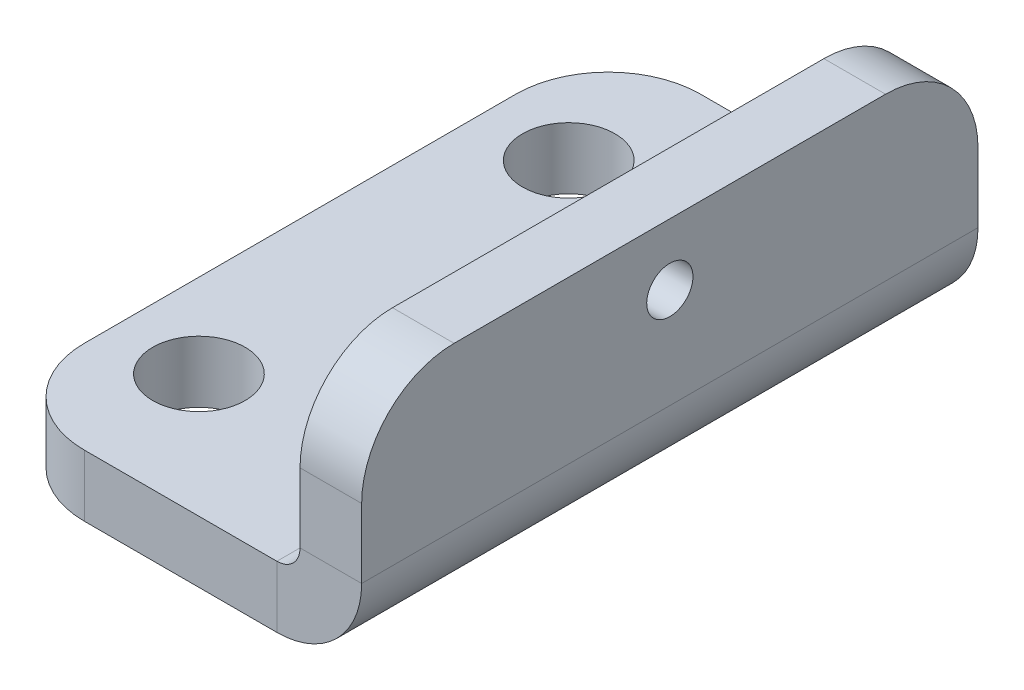
ISO-10303-21;
HEADER;
FILE_DESCRIPTION(('STEP AP214'),'2;1');
FILE_NAME('part.step','',(''),(''),'','','');
FILE_SCHEMA(('AUTOMOTIVE_DESIGN { 1 0 10303 214 1 1 1 1 }'));
ENDSEC;
DATA;
#1=APPLICATION_CONTEXT('core data for automotive mechanical design processes');
#2=APPLICATION_PROTOCOL_DEFINITION('international standard','automotive_design',2000,#1);
#3=PRODUCT_CONTEXT('',#1,'mechanical');
#4=PRODUCT('Part','Part','',(#3));
#5=PRODUCT_RELATED_PRODUCT_CATEGORY('part','',(#4));
#6=PRODUCT_DEFINITION_FORMATION('','',#4);
#7=PRODUCT_DEFINITION_CONTEXT('part definition',#1,'design');
#8=PRODUCT_DEFINITION('design','',#6,#7);
#9=PRODUCT_DEFINITION_SHAPE('','',#8);
#10=(LENGTH_UNIT() NAMED_UNIT(*) SI_UNIT(.MILLI.,.METRE.));
#11=(NAMED_UNIT(*) PLANE_ANGLE_UNIT() SI_UNIT($,.RADIAN.));
#12=(NAMED_UNIT(*) SI_UNIT($,.STERADIAN.) SOLID_ANGLE_UNIT());
#13=UNCERTAINTY_MEASURE_WITH_UNIT(LENGTH_MEASURE(1.E-05),#10,'distance_accuracy_value','');
#14=(GEOMETRIC_REPRESENTATION_CONTEXT(3) GLOBAL_UNCERTAINTY_ASSIGNED_CONTEXT((#13)) GLOBAL_UNIT_ASSIGNED_CONTEXT((#10,
#11,#12)) REPRESENTATION_CONTEXT('',''));
#15=CARTESIAN_POINT('',(0.,0.,0.));
#16=DIRECTION('',(0.,0.,1.));
#17=DIRECTION('',(1.,0.,0.));
#18=AXIS2_PLACEMENT_3D('',#15,#16,#17);
#19=CARTESIAN_POINT('',(-1.73030000789892,1.58601049714401,14.));
#20=DIRECTION('',(0.,1.,0.));
#21=DIRECTION('',(0.,0.,1.));
#22=AXIS2_PLACEMENT_3D('',#19,#20,#21);
#23=PLANE('',#22);
#24=CARTESIAN_POINT('',(-2.29030000789893,1.58601049714401,-12.));
#25=DIRECTION('',(0.,1.,0.));
#26=DIRECTION('',(0.,0.,1.));
#27=AXIS2_PLACEMENT_3D('',#24,#25,#26);
#28=CIRCLE('',#27,3.);
#29=CARTESIAN_POINT('',(-2.29030000789893,1.58601049714401,-9.));
#30=VERTEX_POINT('',#29);
#31=EDGE_CURVE('E221',#30,#30,#28,.T.);
#32=ORIENTED_EDGE('',*,*,#31,.F.);
#33=EDGE_LOOP('',(#32));
#34=FACE_BOUND('',#33,.T.);
#35=CARTESIAN_POINT('',(-2.29030000789892,1.58601049714401,12.));
#36=DIRECTION('',(0.,1.,0.));
#37=DIRECTION('',(0.,0.,1.));
#38=AXIS2_PLACEMENT_3D('',#35,#36,#37);
#39=CIRCLE('',#38,3.);
#40=CARTESIAN_POINT('',(-2.29030000789892,1.58601049714401,15.));
#41=VERTEX_POINT('',#40);
#42=EDGE_CURVE('E215',#41,#41,#39,.T.);
#43=ORIENTED_EDGE('',*,*,#42,.F.);
#44=EDGE_LOOP('',(#43));
#45=FACE_BOUND('',#44,.T.);
#46=DIRECTION('',(1.,0.,0.));
#47=VECTOR('',#46,1.);
#48=CARTESIAN_POINT('',(-1.73030000789892,1.58601049714401,20.));
#49=LINE('',#48,#47);
#50=CARTESIAN_POINT('',(-1.73030000789892,1.58601049714401,20.));
#51=VERTEX_POINT('',#50);
#52=CARTESIAN_POINT('',(10.7696999921011,1.58601049714401,20.));
#53=VERTEX_POINT('',#52);
#54=EDGE_CURVE('E236',#51,#53,#49,.T.);
#55=ORIENTED_EDGE('',*,*,#54,.T.);
#56=DIRECTION('',(0.,0.,-1.));
#57=VECTOR('',#56,1.);
#58=CARTESIAN_POINT('',(10.7696999921011,1.58601049714401,-20.));
#59=LINE('',#58,#57);
#60=CARTESIAN_POINT('',(10.7696999921011,1.58601049714401,-20.));
#61=VERTEX_POINT('',#60);
#62=EDGE_CURVE('E205',#61,#53,#59,.F.);
#63=ORIENTED_EDGE('',*,*,#62,.F.);
#64=DIRECTION('',(-1.,0.,0.));
#65=VECTOR('',#64,1.);
#66=CARTESIAN_POINT('',(-1.73030000789893,1.58601049714401,-20.));
#67=LINE('',#66,#65);
#68=CARTESIAN_POINT('',(-1.73030000789893,1.58601049714401,-20.));
#69=VERTEX_POINT('',#68);
#70=EDGE_CURVE('E227',#61,#69,#67,.T.);
#71=ORIENTED_EDGE('',*,*,#70,.T.);
#72=CARTESIAN_POINT('',(-1.73030000789893,1.58601049714401,-14.));
#73=DIRECTION('',(0.,1.,0.));
#74=DIRECTION('',(0.,0.,-1.));
#75=AXIS2_PLACEMENT_3D('',#72,#73,#74);
#76=CIRCLE('',#75,6.);
#77=CARTESIAN_POINT('',(-7.73030000789893,1.58601049714401,-14.));
#78=VERTEX_POINT('',#77);
#79=EDGE_CURVE('E229',#69,#78,#76,.T.);
#80=ORIENTED_EDGE('',*,*,#79,.T.);
#81=DIRECTION('',(0.,0.,1.));
#82=VECTOR('',#81,1.);
#83=CARTESIAN_POINT('',(-7.73030000789893,1.58601049714401,-14.));
#84=LINE('',#83,#82);
#85=CARTESIAN_POINT('',(-7.73030000789892,1.58601049714401,14.));
#86=VERTEX_POINT('',#85);
#87=EDGE_CURVE('E232',#78,#86,#84,.T.);
#88=ORIENTED_EDGE('',*,*,#87,.T.);
#89=CARTESIAN_POINT('',(-1.73030000789892,1.58601049714401,14.));
#90=DIRECTION('',(0.,1.,0.));
#91=DIRECTION('',(0.,0.,1.));
#92=AXIS2_PLACEMENT_3D('',#89,#90,#91);
#93=CIRCLE('',#92,6.);
#94=EDGE_CURVE('E234',#86,#51,#93,.T.);
#95=ORIENTED_EDGE('',*,*,#94,.T.);
#96=EDGE_LOOP('',(#55,#63,#71,#80,#88,#95));
#97=FACE_BOUND('',#96,.T.);
#98=ADVANCED_FACE('F61',(#34,#45,#97),#23,.T.);
#99=CARTESIAN_POINT('',(-1.73030000789892,-2.41398950285599,14.));
#100=DIRECTION('',(0.,1.,0.));
#101=DIRECTION('',(0.,0.,1.));
#102=AXIS2_PLACEMENT_3D('',#99,#100,#101);
#103=PLANE('',#102);
#104=CARTESIAN_POINT('',(-2.29030000789892,-2.41398950285599,12.));
#105=DIRECTION('',(0.,1.,0.));
#106=DIRECTION('',(0.,0.,1.));
#107=AXIS2_PLACEMENT_3D('',#104,#105,#106);
#108=CIRCLE('',#107,3.);
#109=CARTESIAN_POINT('',(-2.29030000789892,-2.41398950285599,15.));
#110=VERTEX_POINT('',#109);
#111=EDGE_CURVE('E212',#110,#110,#108,.T.);
#112=ORIENTED_EDGE('',*,*,#111,.T.);
#113=EDGE_LOOP('',(#112));
#114=FACE_BOUND('',#113,.T.);
#115=CARTESIAN_POINT('',(-2.29030000789893,-2.41398950285599,-12.));
#116=DIRECTION('',(0.,1.,0.));
#117=DIRECTION('',(0.,0.,1.));
#118=AXIS2_PLACEMENT_3D('',#115,#116,#117);
#119=CIRCLE('',#118,3.);
#120=CARTESIAN_POINT('',(-2.29030000789893,-2.41398950285599,-9.));
#121=VERTEX_POINT('',#120);
#122=EDGE_CURVE('E218',#121,#121,#119,.T.);
#123=ORIENTED_EDGE('',*,*,#122,.T.);
#124=EDGE_LOOP('',(#123));
#125=FACE_BOUND('',#124,.T.);
#126=DIRECTION('',(0.,0.,-1.));
#127=VECTOR('',#126,1.);
#128=CARTESIAN_POINT('',(10.7696999921011,-2.41398950285599,-20.));
#129=LINE('',#128,#127);
#130=CARTESIAN_POINT('',(10.7696999921011,-2.41398950285599,-20.));
#131=VERTEX_POINT('',#130);
#132=CARTESIAN_POINT('',(10.7696999921011,-2.41398950285599,20.));
#133=VERTEX_POINT('',#132);
#134=EDGE_CURVE('E161',#131,#133,#129,.F.);
#135=ORIENTED_EDGE('',*,*,#134,.T.);
#136=DIRECTION('',(1.,0.,0.));
#137=VECTOR('',#136,1.);
#138=CARTESIAN_POINT('',(-1.73030000789892,-2.41398950285599,20.));
#139=LINE('',#138,#137);
#140=CARTESIAN_POINT('',(-1.73030000789892,-2.41398950285599,20.));
#141=VERTEX_POINT('',#140);
#142=EDGE_CURVE('E230',#141,#133,#139,.T.);
#143=ORIENTED_EDGE('',*,*,#142,.F.);
#144=CARTESIAN_POINT('',(-1.73030000789892,-2.41398950285599,14.));
#145=DIRECTION('',(0.,1.,0.));
#146=DIRECTION('',(0.,0.,1.));
#147=AXIS2_PLACEMENT_3D('',#144,#145,#146);
#148=CIRCLE('',#147,6.);
#149=CARTESIAN_POINT('',(-7.73030000789892,-2.41398950285599,14.));
#150=VERTEX_POINT('',#149);
#151=EDGE_CURVE('E245',#150,#141,#148,.T.);
#152=ORIENTED_EDGE('',*,*,#151,.F.);
#153=DIRECTION('',(0.,0.,1.));
#154=VECTOR('',#153,1.);
#155=CARTESIAN_POINT('',(-7.73030000789893,-2.41398950285599,-14.));
#156=LINE('',#155,#154);
#157=CARTESIAN_POINT('',(-7.73030000789893,-2.41398950285599,-14.));
#158=VERTEX_POINT('',#157);
#159=EDGE_CURVE('E243',#158,#150,#156,.T.);
#160=ORIENTED_EDGE('',*,*,#159,.F.);
#161=CARTESIAN_POINT('',(-1.73030000789893,-2.41398950285599,-14.));
#162=DIRECTION('',(0.,1.,0.));
#163=DIRECTION('',(0.,0.,-1.));
#164=AXIS2_PLACEMENT_3D('',#161,#162,#163);
#165=CIRCLE('',#164,6.);
#166=CARTESIAN_POINT('',(-1.73030000789893,-2.41398950285599,-20.));
#167=VERTEX_POINT('',#166);
#168=EDGE_CURVE('E241',#167,#158,#165,.T.);
#169=ORIENTED_EDGE('',*,*,#168,.F.);
#170=DIRECTION('',(-1.,0.,0.));
#171=VECTOR('',#170,1.);
#172=CARTESIAN_POINT('',(-1.73030000789893,-2.41398950285599,-20.));
#173=LINE('',#172,#171);
#174=EDGE_CURVE('E224',#131,#167,#173,.T.);
#175=ORIENTED_EDGE('',*,*,#174,.F.);
#176=EDGE_LOOP('',(#135,#143,#152,#160,#169,#175));
#177=FACE_BOUND('',#176,.T.);
#178=ADVANCED_FACE('F305',(#114,#125,#177),#103,.F.);
#179=CARTESIAN_POINT('',(-1.73030000789893,1.58601049714401,-20.));
#180=DIRECTION('',(0.,0.,1.));
#181=DIRECTION('',(1.,0.,0.));
#182=AXIS2_PLACEMENT_3D('',#179,#180,#181);
#183=PLANE('',#182);
#184=DIRECTION('',(0.,-1.,0.));
#185=VECTOR('',#184,1.);
#186=CARTESIAN_POINT('',(10.7696999921011,1.58601049714401,-20.));
#187=LINE('',#186,#185);
#188=EDGE_CURVE('E201',#61,#131,#187,.T.);
#189=ORIENTED_EDGE('',*,*,#188,.T.);
#190=ORIENTED_EDGE('',*,*,#174,.T.);
#191=DIRECTION('',(0.,-1.,0.));
#192=VECTOR('',#191,1.);
#193=CARTESIAN_POINT('',(-1.73030000789893,1.58601049714401,-20.));
#194=LINE('',#193,#192);
#195=EDGE_CURVE('E256',#69,#167,#194,.T.);
#196=ORIENTED_EDGE('',*,*,#195,.F.);
#197=ORIENTED_EDGE('',*,*,#70,.F.);
#198=EDGE_LOOP('',(#189,#190,#196,#197));
#199=FACE_BOUND('',#198,.T.);
#200=ADVANCED_FACE('F310',(#199),#183,.F.);
#201=CARTESIAN_POINT('',(-1.73030000789892,1.58601049714401,20.));
#202=DIRECTION('',(0.,0.,-1.));
#203=DIRECTION('',(-1.,0.,0.));
#204=AXIS2_PLACEMENT_3D('',#201,#202,#203);
#205=PLANE('',#204);
#206=DIRECTION('',(0.,-1.,0.));
#207=VECTOR('',#206,1.);
#208=CARTESIAN_POINT('',(10.7696999921011,1.58601049714401,20.));
#209=LINE('',#208,#207);
#210=EDGE_CURVE('E209',#53,#133,#209,.T.);
#211=ORIENTED_EDGE('',*,*,#210,.F.);
#212=ORIENTED_EDGE('',*,*,#54,.F.);
#213=DIRECTION('',(0.,-1.,0.));
#214=VECTOR('',#213,1.);
#215=CARTESIAN_POINT('',(-1.73030000789892,1.58601049714401,20.));
#216=LINE('',#215,#214);
#217=EDGE_CURVE('E239',#51,#141,#216,.T.);
#218=ORIENTED_EDGE('',*,*,#217,.T.);
#219=ORIENTED_EDGE('',*,*,#142,.T.);
#220=EDGE_LOOP('',(#211,#212,#218,#219));
#221=FACE_BOUND('',#220,.T.);
#222=ADVANCED_FACE('F293',(#221),#205,.F.);
#223=CARTESIAN_POINT('',(-1.73030000789893,1.58601049714401,-14.));
#224=DIRECTION('',(0.,-1.,0.));
#225=DIRECTION('',(0.,0.,-1.));
#226=AXIS2_PLACEMENT_3D('',#223,#224,#225);
#227=CYLINDRICAL_SURFACE('',#226,6.);
#228=ORIENTED_EDGE('',*,*,#168,.T.);
#229=DIRECTION('',(0.,-1.,0.));
#230=VECTOR('',#229,1.);
#231=CARTESIAN_POINT('',(-7.73030000789893,1.58601049714401,-14.));
#232=LINE('',#231,#230);
#233=EDGE_CURVE('E253',#78,#158,#232,.T.);
#234=ORIENTED_EDGE('',*,*,#233,.F.);
#235=ORIENTED_EDGE('',*,*,#79,.F.);
#236=ORIENTED_EDGE('',*,*,#195,.T.);
#237=EDGE_LOOP('',(#228,#234,#235,#236));
#238=FACE_BOUND('',#237,.T.);
#239=ADVANCED_FACE('F314',(#238),#227,.T.);
#240=CARTESIAN_POINT('',(-7.73030000789893,1.58601049714401,-14.));
#241=DIRECTION('',(1.,0.,0.));
#242=DIRECTION('',(0.,0.,-1.));
#243=AXIS2_PLACEMENT_3D('',#240,#241,#242);
#244=PLANE('',#243);
#245=ORIENTED_EDGE('',*,*,#159,.T.);
#246=DIRECTION('',(0.,-1.,0.));
#247=VECTOR('',#246,1.);
#248=CARTESIAN_POINT('',(-7.73030000789892,1.58601049714401,14.));
#249=LINE('',#248,#247);
#250=EDGE_CURVE('E250',#86,#150,#249,.T.);
#251=ORIENTED_EDGE('',*,*,#250,.F.);
#252=ORIENTED_EDGE('',*,*,#87,.F.);
#253=ORIENTED_EDGE('',*,*,#233,.T.);
#254=EDGE_LOOP('',(#245,#251,#252,#253));
#255=FACE_BOUND('',#254,.T.);
#256=ADVANCED_FACE('F316',(#255),#244,.F.);
#257=CARTESIAN_POINT('',(-1.73030000789892,1.58601049714401,14.));
#258=DIRECTION('',(0.,-1.,0.));
#259=DIRECTION('',(0.,0.,-1.));
#260=AXIS2_PLACEMENT_3D('',#257,#258,#259);
#261=CYLINDRICAL_SURFACE('',#260,6.);
#262=ORIENTED_EDGE('',*,*,#151,.T.);
#263=ORIENTED_EDGE('',*,*,#217,.F.);
#264=ORIENTED_EDGE('',*,*,#94,.F.);
#265=ORIENTED_EDGE('',*,*,#250,.T.);
#266=EDGE_LOOP('',(#262,#263,#264,#265));
#267=FACE_BOUND('',#266,.T.);
#268=ADVANCED_FACE('F302',(#267),#261,.T.);
#269=CARTESIAN_POINT('',(-2.29030000789893,1.58601049714401,-12.));
#270=DIRECTION('',(0.,-1.,0.));
#271=DIRECTION('',(0.,0.,-1.));
#272=AXIS2_PLACEMENT_3D('',#269,#270,#271);
#273=CYLINDRICAL_SURFACE('',#272,3.);
#274=ORIENTED_EDGE('',*,*,#31,.T.);
#275=EDGE_LOOP('',(#274));
#276=FACE_BOUND('',#275,.T.);
#277=ORIENTED_EDGE('',*,*,#122,.F.);
#278=EDGE_LOOP('',(#277));
#279=FACE_BOUND('',#278,.T.);
#280=ADVANCED_FACE('F323',(#276,#279),#273,.F.);
#281=CARTESIAN_POINT('',(-2.29030000789892,1.58601049714401,12.));
#282=DIRECTION('',(0.,-1.,0.));
#283=DIRECTION('',(0.,0.,-1.));
#284=AXIS2_PLACEMENT_3D('',#281,#282,#283);
#285=CYLINDRICAL_SURFACE('',#284,3.);
#286=ORIENTED_EDGE('',*,*,#42,.T.);
#287=EDGE_LOOP('',(#286));
#288=FACE_BOUND('',#287,.T.);
#289=ORIENTED_EDGE('',*,*,#111,.F.);
#290=EDGE_LOOP('',(#289));
#291=FACE_BOUND('',#290,.T.);
#292=ADVANCED_FACE('F377',(#288,#291),#285,.F.);
#293=CARTESIAN_POINT('',(10.7696999921011,3.08601049714401,20.));
#294=DIRECTION('',(0.,0.,1.));
#295=DIRECTION('',(1.,0.,0.));
#296=AXIS2_PLACEMENT_3D('',#293,#294,#295);
#297=PLANE('',#296);
#298=DIRECTION('',(-1.,0.,0.));
#299=VECTOR('',#298,1.);
#300=CARTESIAN_POINT('',(16.2696999921011,3.08601049714399,20.));
#301=LINE('',#300,#299);
#302=CARTESIAN_POINT('',(12.2696999921011,3.08601049714401,20.));
#303=VERTEX_POINT('',#302);
#304=CARTESIAN_POINT('',(16.2696999921011,3.086010497144,20.));
#305=VERTEX_POINT('',#304);
#306=EDGE_CURVE('E195',#303,#305,#301,.F.);
#307=ORIENTED_EDGE('',*,*,#306,.F.);
#308=CARTESIAN_POINT('',(10.7696999921011,3.08601049714401,20.));
#309=DIRECTION('',(0.,0.,-1.));
#310=DIRECTION('',(-1.,0.,0.));
#311=AXIS2_PLACEMENT_3D('',#308,#309,#310);
#312=CIRCLE('',#311,1.5);
#313=EDGE_CURVE('E164',#53,#303,#312,.F.);
#314=ORIENTED_EDGE('',*,*,#313,.F.);
#315=ORIENTED_EDGE('',*,*,#210,.T.);
#316=CARTESIAN_POINT('',(10.7696999921011,3.08601049714401,20.));
#317=DIRECTION('',(0.,0.,-1.));
#318=DIRECTION('',(-1.,0.,0.));
#319=AXIS2_PLACEMENT_3D('',#316,#317,#318);
#320=CIRCLE('',#319,5.50000000000001);
#321=EDGE_CURVE('E200',#133,#305,#320,.F.);
#322=ORIENTED_EDGE('',*,*,#321,.T.);
#323=EDGE_LOOP('',(#307,#314,#315,#322));
#324=FACE_BOUND('',#323,.T.);
#325=ADVANCED_FACE('F290',(#324),#297,.T.);
#326=CARTESIAN_POINT('',(10.7696999921011,3.08601049714401,-20.));
#327=DIRECTION('',(0.,0.,1.));
#328=DIRECTION('',(1.,0.,0.));
#329=AXIS2_PLACEMENT_3D('',#326,#327,#328);
#330=PLANE('',#329);
#331=CARTESIAN_POINT('',(10.7696999921011,3.08601049714401,-20.));
#332=DIRECTION('',(0.,0.,-1.));
#333=DIRECTION('',(-1.,0.,0.));
#334=AXIS2_PLACEMENT_3D('',#331,#332,#333);
#335=CIRCLE('',#334,1.5);
#336=CARTESIAN_POINT('',(12.2696999921011,3.08601049714401,-20.));
#337=VERTEX_POINT('',#336);
#338=EDGE_CURVE('E171',#337,#61,#335,.T.);
#339=ORIENTED_EDGE('',*,*,#338,.F.);
#340=DIRECTION('',(-1.,0.,0.));
#341=VECTOR('',#340,1.);
#342=CARTESIAN_POINT('',(12.2696999921011,3.08601049714401,-20.));
#343=LINE('',#342,#341);
#344=CARTESIAN_POINT('',(16.2696999921011,3.086010497144,-20.));
#345=VERTEX_POINT('',#344);
#346=EDGE_CURVE('E168',#337,#345,#343,.F.);
#347=ORIENTED_EDGE('',*,*,#346,.T.);
#348=CARTESIAN_POINT('',(10.7696999921011,3.08601049714401,-20.));
#349=DIRECTION('',(0.,0.,-1.));
#350=DIRECTION('',(-1.,0.,0.));
#351=AXIS2_PLACEMENT_3D('',#348,#349,#350);
#352=CIRCLE('',#351,5.50000000000001);
#353=EDGE_CURVE('E153',#345,#131,#352,.T.);
#354=ORIENTED_EDGE('',*,*,#353,.T.);
#355=ORIENTED_EDGE('',*,*,#188,.F.);
#356=EDGE_LOOP('',(#339,#347,#354,#355));
#357=FACE_BOUND('',#356,.T.);
#358=ADVANCED_FACE('F169',(#357),#330,.F.);
#359=CARTESIAN_POINT('',(10.7696999921011,3.08601049714401,-20.));
#360=DIRECTION('',(0.,0.,-1.));
#361=DIRECTION('',(1.,0.,0.));
#362=AXIS2_PLACEMENT_3D('',#359,#360,#361);
#363=CYLINDRICAL_SURFACE('',#362,5.50000000000001);
#364=ORIENTED_EDGE('',*,*,#134,.F.);
#365=ORIENTED_EDGE('',*,*,#353,.F.);
#366=DIRECTION('',(0.,0.,-1.));
#367=VECTOR('',#366,1.);
#368=CARTESIAN_POINT('',(16.2696999921011,3.08601049714399,20.));
#369=LINE('',#368,#367);
#370=EDGE_CURVE('E158',#345,#305,#369,.F.);
#371=ORIENTED_EDGE('',*,*,#370,.T.);
#372=ORIENTED_EDGE('',*,*,#321,.F.);
#373=EDGE_LOOP('',(#364,#365,#371,#372));
#374=FACE_BOUND('',#373,.T.);
#375=ADVANCED_FACE('F155',(#374),#363,.T.);
#376=CARTESIAN_POINT('',(10.7696999921011,3.08601049714401,-20.));
#377=DIRECTION('',(0.,0.,-1.));
#378=DIRECTION('',(1.,0.,0.));
#379=AXIS2_PLACEMENT_3D('',#376,#377,#378);
#380=CYLINDRICAL_SURFACE('',#379,1.5);
#381=ORIENTED_EDGE('',*,*,#62,.T.);
#382=ORIENTED_EDGE('',*,*,#313,.T.);
#383=DIRECTION('',(0.,0.,-1.));
#384=VECTOR('',#383,1.);
#385=CARTESIAN_POINT('',(12.2696999921011,3.08601049714401,20.));
#386=LINE('',#385,#384);
#387=EDGE_CURVE('E173',#303,#337,#386,.T.);
#388=ORIENTED_EDGE('',*,*,#387,.T.);
#389=ORIENTED_EDGE('',*,*,#338,.T.);
#390=EDGE_LOOP('',(#381,#382,#388,#389));
#391=FACE_BOUND('',#390,.T.);
#392=ADVANCED_FACE('F287',(#391),#380,.F.);
#393=CARTESIAN_POINT('',(16.2696999921011,13.586010497144,-20.));
#394=DIRECTION('',(0.,0.,1.));
#395=DIRECTION('',(0.,-1.,0.));
#396=AXIS2_PLACEMENT_3D('',#393,#394,#395);
#397=PLANE('',#396);
#398=DIRECTION('',(0.,-1.,0.));
#399=VECTOR('',#398,1.);
#400=CARTESIAN_POINT('',(12.2696999921011,13.586010497144,-20.));
#401=LINE('',#400,#399);
#402=CARTESIAN_POINT('',(12.2696999921011,7.58601049714403,-20.));
#403=VERTEX_POINT('',#402);
#404=EDGE_CURVE('E181',#337,#403,#401,.F.);
#405=ORIENTED_EDGE('',*,*,#404,.T.);
#406=DIRECTION('',(-1.,0.,0.));
#407=VECTOR('',#406,1.);
#408=CARTESIAN_POINT('',(16.2696999921011,7.58601049714402,-20.));
#409=LINE('',#408,#407);
#410=CARTESIAN_POINT('',(16.2696999921011,7.58601049714402,-20.));
#411=VERTEX_POINT('',#410);
#412=EDGE_CURVE('E13',#403,#411,#409,.F.);
#413=ORIENTED_EDGE('',*,*,#412,.T.);
#414=DIRECTION('',(0.,1.,0.));
#415=VECTOR('',#414,1.);
#416=CARTESIAN_POINT('',(16.2696999921011,-2.41398950285608,-20.));
#417=LINE('',#416,#415);
#418=EDGE_CURVE('E177',#345,#411,#417,.T.);
#419=ORIENTED_EDGE('',*,*,#418,.F.);
#420=ORIENTED_EDGE('',*,*,#346,.F.);
#421=EDGE_LOOP('',(#405,#413,#419,#420));
#422=FACE_BOUND('',#421,.T.);
#423=ADVANCED_FACE('F183',(#422),#397,.F.);
#424=CARTESIAN_POINT('',(16.2696999921011,1.586010497144,20.));
#425=DIRECTION('',(0.,0.,-1.));
#426=DIRECTION('',(0.,1.,0.));
#427=AXIS2_PLACEMENT_3D('',#424,#425,#426);
#428=PLANE('',#427);
#429=DIRECTION('',(0.,-1.,0.));
#430=VECTOR('',#429,1.);
#431=CARTESIAN_POINT('',(16.2696999921011,-2.41398950285609,20.));
#432=LINE('',#431,#430);
#433=CARTESIAN_POINT('',(16.2696999921011,7.58601049714401,20.));
#434=VERTEX_POINT('',#433);
#435=EDGE_CURVE('E180',#434,#305,#432,.T.);
#436=ORIENTED_EDGE('',*,*,#435,.F.);
#437=DIRECTION('',(-1.,0.,0.));
#438=VECTOR('',#437,1.);
#439=CARTESIAN_POINT('',(16.2696999921011,7.58601049714401,20.));
#440=LINE('',#439,#438);
#441=CARTESIAN_POINT('',(12.2696999921011,7.58601049714403,20.));
#442=VERTEX_POINT('',#441);
#443=EDGE_CURVE('E259',#434,#442,#440,.T.);
#444=ORIENTED_EDGE('',*,*,#443,.T.);
#445=DIRECTION('',(0.,1.,0.));
#446=VECTOR('',#445,1.);
#447=CARTESIAN_POINT('',(12.2696999921011,1.58601049714401,20.));
#448=LINE('',#447,#446);
#449=EDGE_CURVE('E185',#442,#303,#448,.F.);
#450=ORIENTED_EDGE('',*,*,#449,.T.);
#451=ORIENTED_EDGE('',*,*,#306,.T.);
#452=EDGE_LOOP('',(#436,#444,#450,#451));
#453=FACE_BOUND('',#452,.T.);
#454=ADVANCED_FACE('F275',(#453),#428,.F.);
#455=CARTESIAN_POINT('',(16.2696999921011,-2.41398950285608,0.));
#456=DIRECTION('',(-1.,0.,0.));
#457=DIRECTION('',(0.,-1.,0.));
#458=AXIS2_PLACEMENT_3D('',#455,#456,#457);
#459=PLANE('',#458);
#460=CARTESIAN_POINT('',(16.2696999921011,9.58601049714401,0.));
#461=DIRECTION('',(-1.,0.,0.));
#462=DIRECTION('',(0.,-1.,0.));
#463=AXIS2_PLACEMENT_3D('',#460,#461,#462);
#464=CIRCLE('',#463,1.5);
#465=CARTESIAN_POINT('',(16.2696999921011,8.08601049714401,0.));
#466=VERTEX_POINT('',#465);
#467=EDGE_CURVE('E198',#466,#466,#464,.T.);
#468=ORIENTED_EDGE('',*,*,#467,.T.);
#469=EDGE_LOOP('',(#468));
#470=FACE_BOUND('',#469,.T.);
#471=DIRECTION('',(0.,0.,1.));
#472=VECTOR('',#471,1.);
#473=CARTESIAN_POINT('',(16.2696999921011,13.586010497144,0.));
#474=LINE('',#473,#472);
#475=CARTESIAN_POINT('',(16.2696999921011,13.586010497144,-14.));
#476=VERTEX_POINT('',#475);
#477=CARTESIAN_POINT('',(16.2696999921011,13.586010497144,14.));
#478=VERTEX_POINT('',#477);
#479=EDGE_CURVE('E184',#476,#478,#474,.T.);
#480=ORIENTED_EDGE('',*,*,#479,.T.);
#481=CARTESIAN_POINT('',(16.2696999921011,7.58601049714401,14.));
#482=DIRECTION('',(-1.,0.,0.));
#483=DIRECTION('',(0.,-1.,0.));
#484=AXIS2_PLACEMENT_3D('',#481,#482,#483);
#485=CIRCLE('',#484,6.);
#486=EDGE_CURVE('E69',#478,#434,#485,.F.);
#487=ORIENTED_EDGE('',*,*,#486,.T.);
#488=ORIENTED_EDGE('',*,*,#435,.T.);
#489=ORIENTED_EDGE('',*,*,#370,.F.);
#490=ORIENTED_EDGE('',*,*,#418,.T.);
#491=CARTESIAN_POINT('',(16.2696999921011,7.58601049714401,-14.));
#492=DIRECTION('',(-1.,0.,0.));
#493=DIRECTION('',(0.,-1.,0.));
#494=AXIS2_PLACEMENT_3D('',#491,#492,#493);
#495=CIRCLE('',#494,6.);
#496=EDGE_CURVE('E270',#411,#476,#495,.F.);
#497=ORIENTED_EDGE('',*,*,#496,.T.);
#498=EDGE_LOOP('',(#480,#487,#488,#489,#490,#497));
#499=FACE_BOUND('',#498,.T.);
#500=ADVANCED_FACE('F176',(#470,#499),#459,.F.);
#501=CARTESIAN_POINT('',(12.2696999921011,-2.41398950285607,0.));
#502=DIRECTION('',(-1.,0.,0.));
#503=DIRECTION('',(0.,-1.,0.));
#504=AXIS2_PLACEMENT_3D('',#501,#502,#503);
#505=PLANE('',#504);
#506=CARTESIAN_POINT('',(12.2696999921011,9.58601049714403,0.));
#507=DIRECTION('',(-1.,0.,0.));
#508=DIRECTION('',(0.,-1.,0.));
#509=AXIS2_PLACEMENT_3D('',#506,#507,#508);
#510=CIRCLE('',#509,1.5);
#511=CARTESIAN_POINT('',(12.2696999921011,8.08601049714403,0.));
#512=VERTEX_POINT('',#511);
#513=EDGE_CURVE('E542',#512,#512,#510,.T.);
#514=ORIENTED_EDGE('',*,*,#513,.F.);
#515=EDGE_LOOP('',(#514));
#516=FACE_BOUND('',#515,.T.);
#517=ORIENTED_EDGE('',*,*,#449,.F.);
#518=CARTESIAN_POINT('',(12.2696999921011,7.58601049714403,14.));
#519=DIRECTION('',(-1.,0.,0.));
#520=DIRECTION('',(0.,-1.,0.));
#521=AXIS2_PLACEMENT_3D('',#518,#519,#520);
#522=CIRCLE('',#521,6.);
#523=CARTESIAN_POINT('',(12.2696999921011,13.586010497144,14.));
#524=VERTEX_POINT('',#523);
#525=EDGE_CURVE('E264',#442,#524,#522,.T.);
#526=ORIENTED_EDGE('',*,*,#525,.T.);
#527=DIRECTION('',(0.,0.,-1.));
#528=VECTOR('',#527,1.);
#529=CARTESIAN_POINT('',(12.2696999921011,13.586010497144,20.));
#530=LINE('',#529,#528);
#531=CARTESIAN_POINT('',(12.2696999921011,13.586010497144,-14.));
#532=VERTEX_POINT('',#531);
#533=EDGE_CURVE('E188',#532,#524,#530,.F.);
#534=ORIENTED_EDGE('',*,*,#533,.F.);
#535=CARTESIAN_POINT('',(12.2696999921011,7.58601049714403,-14.));
#536=DIRECTION('',(-1.,0.,0.));
#537=DIRECTION('',(0.,-1.,0.));
#538=AXIS2_PLACEMENT_3D('',#535,#536,#537);
#539=CIRCLE('',#538,6.);
#540=EDGE_CURVE('E262',#532,#403,#539,.T.);
#541=ORIENTED_EDGE('',*,*,#540,.T.);
#542=ORIENTED_EDGE('',*,*,#404,.F.);
#543=ORIENTED_EDGE('',*,*,#387,.F.);
#544=EDGE_LOOP('',(#517,#526,#534,#541,#542,#543));
#545=FACE_BOUND('',#544,.T.);
#546=ADVANCED_FACE('F281',(#516,#545),#505,.T.);
#547=CARTESIAN_POINT('',(16.2696999921011,13.586010497144,20.));
#548=DIRECTION('',(0.,-1.,0.));
#549=DIRECTION('',(1.,0.,0.));
#550=AXIS2_PLACEMENT_3D('',#547,#548,#549);
#551=PLANE('',#550);
#552=ORIENTED_EDGE('',*,*,#533,.T.);
#553=DIRECTION('',(-1.,0.,0.));
#554=VECTOR('',#553,1.);
#555=CARTESIAN_POINT('',(16.2696999921011,13.586010497144,14.));
#556=LINE('',#555,#554);
#557=EDGE_CURVE('E82',#524,#478,#556,.F.);
#558=ORIENTED_EDGE('',*,*,#557,.T.);
#559=ORIENTED_EDGE('',*,*,#479,.F.);
#560=DIRECTION('',(-1.,0.,0.));
#561=VECTOR('',#560,1.);
#562=CARTESIAN_POINT('',(16.2696999921011,13.586010497144,-14.));
#563=LINE('',#562,#561);
#564=EDGE_CURVE('E266',#476,#532,#563,.T.);
#565=ORIENTED_EDGE('',*,*,#564,.T.);
#566=EDGE_LOOP('',(#552,#558,#559,#565));
#567=FACE_BOUND('',#566,.T.);
#568=ADVANCED_FACE('F283',(#567),#551,.F.);
#569=CARTESIAN_POINT('',(32.2696999921011,9.58601049714396,0.));
#570=DIRECTION('',(-1.,0.,0.));
#571=DIRECTION('',(0.,-1.,0.));
#572=AXIS2_PLACEMENT_3D('',#569,#570,#571);
#573=CYLINDRICAL_SURFACE('',#572,1.5);
#574=ORIENTED_EDGE('',*,*,#513,.T.);
#575=EDGE_LOOP('',(#574));
#576=FACE_BOUND('',#575,.T.);
#577=ORIENTED_EDGE('',*,*,#467,.F.);
#578=EDGE_LOOP('',(#577));
#579=FACE_BOUND('',#578,.T.);
#580=ADVANCED_FACE('F347',(#576,#579),#573,.F.);
#581=CARTESIAN_POINT('',(16.2696999921011,7.58601049714401,14.));
#582=DIRECTION('',(-1.,0.,0.));
#583=DIRECTION('',(0.,-1.,0.));
#584=AXIS2_PLACEMENT_3D('',#581,#582,#583);
#585=CYLINDRICAL_SURFACE('',#584,6.);
#586=ORIENTED_EDGE('',*,*,#486,.F.);
#587=ORIENTED_EDGE('',*,*,#557,.F.);
#588=ORIENTED_EDGE('',*,*,#525,.F.);
#589=ORIENTED_EDGE('',*,*,#443,.F.);
#590=EDGE_LOOP('',(#586,#587,#588,#589));
#591=FACE_BOUND('',#590,.T.);
#592=ADVANCED_FACE('F278',(#591),#585,.T.);
#593=CARTESIAN_POINT('',(16.2696999921011,7.58601049714401,-14.));
#594=DIRECTION('',(-1.,0.,0.));
#595=DIRECTION('',(0.,-1.,0.));
#596=AXIS2_PLACEMENT_3D('',#593,#594,#595);
#597=CYLINDRICAL_SURFACE('',#596,6.);
#598=ORIENTED_EDGE('',*,*,#496,.F.);
#599=ORIENTED_EDGE('',*,*,#412,.F.);
#600=ORIENTED_EDGE('',*,*,#540,.F.);
#601=ORIENTED_EDGE('',*,*,#564,.F.);
#602=EDGE_LOOP('',(#598,#599,#600,#601));
#603=FACE_BOUND('',#602,.T.);
#604=ADVANCED_FACE('F63',(#603),#597,.T.);
#605=CLOSED_SHELL('',(#98,#178,#200,#222,#239,#256,#268,#280,#292,#325,#358,#375,#392,#423,#454,
#500,#546,#568,#580,#592,#604));
#606=MANIFOLD_SOLID_BREP('B2',#605);
#607=ADVANCED_BREP_SHAPE_REPRESENTATION('',(#18,#606),#14);
#608=SHAPE_DEFINITION_REPRESENTATION(#9,#607);
ENDSEC;
END-ISO-10303-21;
